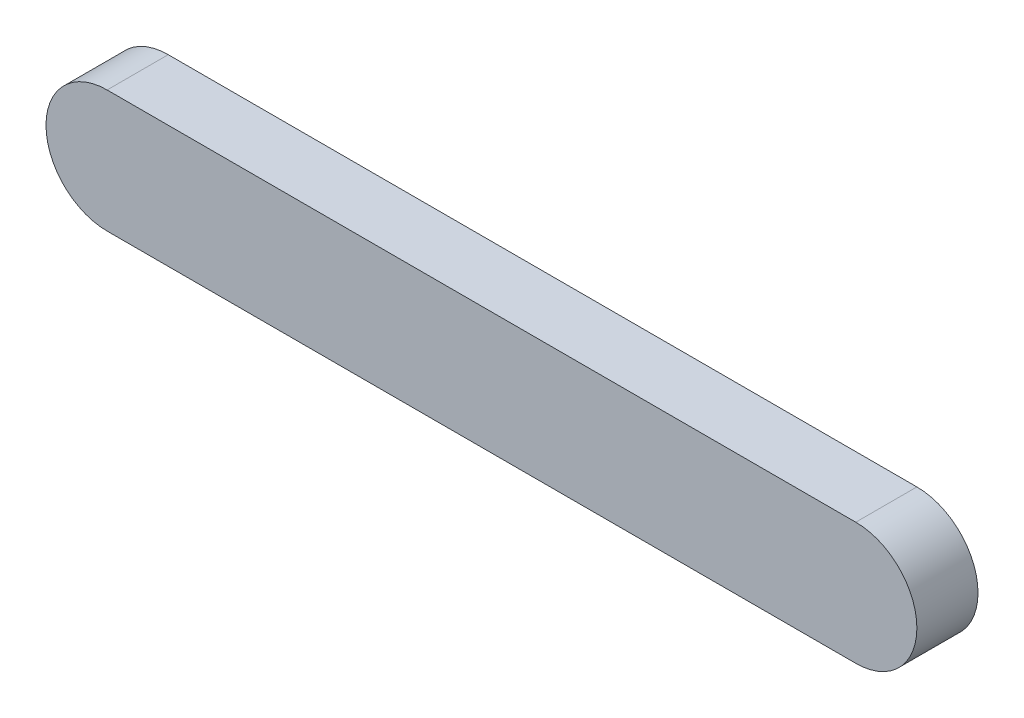
ISO-10303-21;
HEADER;
FILE_DESCRIPTION(('STEP AP214'),'2;1');
FILE_NAME('part.step','',(''),(''),'','','');
FILE_SCHEMA(('AUTOMOTIVE_DESIGN { 1 0 10303 214 1 1 1 1 }'));
ENDSEC;
DATA;
#1=APPLICATION_CONTEXT('core data for automotive mechanical design processes');
#2=APPLICATION_PROTOCOL_DEFINITION('international standard','automotive_design',2000,#1);
#3=PRODUCT_CONTEXT('',#1,'mechanical');
#4=PRODUCT('Part','Part','',(#3));
#5=PRODUCT_RELATED_PRODUCT_CATEGORY('part','',(#4));
#6=PRODUCT_DEFINITION_FORMATION('','',#4);
#7=PRODUCT_DEFINITION_CONTEXT('part definition',#1,'design');
#8=PRODUCT_DEFINITION('design','',#6,#7);
#9=PRODUCT_DEFINITION_SHAPE('','',#8);
#10=(LENGTH_UNIT() NAMED_UNIT(*) SI_UNIT(.MILLI.,.METRE.));
#11=(NAMED_UNIT(*) PLANE_ANGLE_UNIT() SI_UNIT($,.RADIAN.));
#12=(NAMED_UNIT(*) SI_UNIT($,.STERADIAN.) SOLID_ANGLE_UNIT());
#13=UNCERTAINTY_MEASURE_WITH_UNIT(LENGTH_MEASURE(1.E-05),#10,'distance_accuracy_value','');
#14=(GEOMETRIC_REPRESENTATION_CONTEXT(3) GLOBAL_UNCERTAINTY_ASSIGNED_CONTEXT((#13)) GLOBAL_UNIT_ASSIGNED_CONTEXT((#10,
#11,#12)) REPRESENTATION_CONTEXT('',''));
#15=CARTESIAN_POINT('',(0.,0.,0.));
#16=DIRECTION('',(0.,0.,1.));
#17=DIRECTION('',(1.,0.,0.));
#18=AXIS2_PLACEMENT_3D('',#15,#16,#17);
#19=CARTESIAN_POINT('',(0.,0.,20.));
#20=DIRECTION('',(0.,0.,-1.));
#21=DIRECTION('',(-1.,0.,0.));
#22=AXIS2_PLACEMENT_3D('',#19,#20,#21);
#23=CYLINDRICAL_SURFACE('',#22,20.);
#24=CARTESIAN_POINT('',(0.,0.,0.));
#25=DIRECTION('',(0.,0.,1.));
#26=DIRECTION('',(1.,0.,0.));
#27=AXIS2_PLACEMENT_3D('',#24,#25,#26);
#28=CIRCLE('',#27,20.);
#29=CARTESIAN_POINT('',(0.,20.,0.));
#30=VERTEX_POINT('',#29);
#31=CARTESIAN_POINT('',(0.,-20.,0.));
#32=VERTEX_POINT('',#31);
#33=EDGE_CURVE('E102',#30,#32,#28,.T.);
#34=ORIENTED_EDGE('',*,*,#33,.T.);
#35=DIRECTION('',(0.,0.,-1.));
#36=VECTOR('',#35,1.);
#37=CARTESIAN_POINT('',(0.,-20.,20.));
#38=LINE('',#37,#36);
#39=CARTESIAN_POINT('',(0.,-20.,20.));
#40=VERTEX_POINT('',#39);
#41=EDGE_CURVE('E11',#40,#32,#38,.T.);
#42=ORIENTED_EDGE('',*,*,#41,.F.);
#43=CARTESIAN_POINT('',(0.,0.,20.));
#44=DIRECTION('',(0.,0.,1.));
#45=DIRECTION('',(1.,0.,0.));
#46=AXIS2_PLACEMENT_3D('',#43,#44,#45);
#47=CIRCLE('',#46,20.);
#48=CARTESIAN_POINT('',(0.,20.,20.));
#49=VERTEX_POINT('',#48);
#50=EDGE_CURVE('E90',#49,#40,#47,.T.);
#51=ORIENTED_EDGE('',*,*,#50,.F.);
#52=DIRECTION('',(0.,0.,-1.));
#53=VECTOR('',#52,1.);
#54=CARTESIAN_POINT('',(0.,20.,20.));
#55=LINE('',#54,#53);
#56=EDGE_CURVE('E98',#49,#30,#55,.T.);
#57=ORIENTED_EDGE('',*,*,#56,.T.);
#58=EDGE_LOOP('',(#34,#42,#51,#57));
#59=FACE_BOUND('',#58,.T.);
#60=ADVANCED_FACE('F39',(#59),#23,.T.);
#61=CARTESIAN_POINT('',(0.,-20.,20.));
#62=DIRECTION('',(0.,1.,0.));
#63=DIRECTION('',(0.,0.,1.));
#64=AXIS2_PLACEMENT_3D('',#61,#62,#63);
#65=PLANE('',#64);
#66=DIRECTION('',(1.,0.,0.));
#67=VECTOR('',#66,1.);
#68=CARTESIAN_POINT('',(0.,-20.,0.));
#69=LINE('',#68,#67);
#70=CARTESIAN_POINT('',(245.,-20.,0.));
#71=VERTEX_POINT('',#70);
#72=EDGE_CURVE('E94',#32,#71,#69,.T.);
#73=ORIENTED_EDGE('',*,*,#72,.T.);
#74=DIRECTION('',(0.,0.,-1.));
#75=VECTOR('',#74,1.);
#76=CARTESIAN_POINT('',(245.,-20.,20.));
#77=LINE('',#76,#75);
#78=CARTESIAN_POINT('',(245.,-20.,20.));
#79=VERTEX_POINT('',#78);
#80=EDGE_CURVE('E47',#79,#71,#77,.T.);
#81=ORIENTED_EDGE('',*,*,#80,.F.);
#82=DIRECTION('',(1.,0.,0.));
#83=VECTOR('',#82,1.);
#84=CARTESIAN_POINT('',(0.,-20.,20.));
#85=LINE('',#84,#83);
#86=EDGE_CURVE('E85',#40,#79,#85,.T.);
#87=ORIENTED_EDGE('',*,*,#86,.F.);
#88=ORIENTED_EDGE('',*,*,#41,.T.);
#89=EDGE_LOOP('',(#73,#81,#87,#88));
#90=FACE_BOUND('',#89,.T.);
#91=ADVANCED_FACE('F93',(#90),#65,.F.);
#92=CARTESIAN_POINT('',(245.,0.,20.));
#93=DIRECTION('',(0.,0.,-1.));
#94=DIRECTION('',(-1.,0.,0.));
#95=AXIS2_PLACEMENT_3D('',#92,#93,#94);
#96=CYLINDRICAL_SURFACE('',#95,20.);
#97=CARTESIAN_POINT('',(245.,0.,0.));
#98=DIRECTION('',(0.,0.,1.));
#99=DIRECTION('',(1.,0.,0.));
#100=AXIS2_PLACEMENT_3D('',#97,#98,#99);
#101=CIRCLE('',#100,20.);
#102=CARTESIAN_POINT('',(245.,20.,0.));
#103=VERTEX_POINT('',#102);
#104=EDGE_CURVE('E72',#71,#103,#101,.T.);
#105=ORIENTED_EDGE('',*,*,#104,.T.);
#106=DIRECTION('',(0.,0.,-1.));
#107=VECTOR('',#106,1.);
#108=CARTESIAN_POINT('',(245.,20.,20.));
#109=LINE('',#108,#107);
#110=CARTESIAN_POINT('',(245.,20.,20.));
#111=VERTEX_POINT('',#110);
#112=EDGE_CURVE('E95',#111,#103,#109,.T.);
#113=ORIENTED_EDGE('',*,*,#112,.F.);
#114=CARTESIAN_POINT('',(245.,0.,20.));
#115=DIRECTION('',(0.,0.,1.));
#116=DIRECTION('',(1.,0.,0.));
#117=AXIS2_PLACEMENT_3D('',#114,#115,#116);
#118=CIRCLE('',#117,20.);
#119=EDGE_CURVE('E88',#79,#111,#118,.T.);
#120=ORIENTED_EDGE('',*,*,#119,.F.);
#121=ORIENTED_EDGE('',*,*,#80,.T.);
#122=EDGE_LOOP('',(#105,#113,#120,#121));
#123=FACE_BOUND('',#122,.T.);
#124=ADVANCED_FACE('F96',(#123),#96,.T.);
#125=CARTESIAN_POINT('',(0.,20.,20.));
#126=DIRECTION('',(0.,-1.,0.));
#127=DIRECTION('',(0.,0.,-1.));
#128=AXIS2_PLACEMENT_3D('',#125,#126,#127);
#129=PLANE('',#128);
#130=DIRECTION('',(-1.,0.,0.));
#131=VECTOR('',#130,1.);
#132=CARTESIAN_POINT('',(0.,20.,0.));
#133=LINE('',#132,#131);
#134=EDGE_CURVE('E78',#103,#30,#133,.T.);
#135=ORIENTED_EDGE('',*,*,#134,.T.);
#136=ORIENTED_EDGE('',*,*,#56,.F.);
#137=DIRECTION('',(-1.,0.,0.));
#138=VECTOR('',#137,1.);
#139=CARTESIAN_POINT('',(0.,20.,20.));
#140=LINE('',#139,#138);
#141=EDGE_CURVE('E55',#111,#49,#140,.T.);
#142=ORIENTED_EDGE('',*,*,#141,.F.);
#143=ORIENTED_EDGE('',*,*,#112,.T.);
#144=EDGE_LOOP('',(#135,#136,#142,#143));
#145=FACE_BOUND('',#144,.T.);
#146=ADVANCED_FACE('F109',(#145),#129,.F.);
#147=CARTESIAN_POINT('',(0.,0.,20.));
#148=DIRECTION('',(0.,0.,1.));
#149=DIRECTION('',(1.,0.,0.));
#150=AXIS2_PLACEMENT_3D('',#147,#148,#149);
#151=PLANE('',#150);
#152=ORIENTED_EDGE('',*,*,#50,.T.);
#153=ORIENTED_EDGE('',*,*,#86,.T.);
#154=ORIENTED_EDGE('',*,*,#119,.T.);
#155=ORIENTED_EDGE('',*,*,#141,.T.);
#156=EDGE_LOOP('',(#152,#153,#154,#155));
#157=FACE_BOUND('',#156,.T.);
#158=ADVANCED_FACE('F86',(#157),#151,.T.);
#159=CARTESIAN_POINT('',(0.,0.,0.));
#160=DIRECTION('',(0.,0.,1.));
#161=DIRECTION('',(1.,0.,0.));
#162=AXIS2_PLACEMENT_3D('',#159,#160,#161);
#163=PLANE('',#162);
#164=ORIENTED_EDGE('',*,*,#33,.F.);
#165=ORIENTED_EDGE('',*,*,#134,.F.);
#166=ORIENTED_EDGE('',*,*,#104,.F.);
#167=ORIENTED_EDGE('',*,*,#72,.F.);
#168=EDGE_LOOP('',(#164,#165,#166,#167));
#169=FACE_BOUND('',#168,.T.);
#170=ADVANCED_FACE('F112',(#169),#163,.F.);
#171=CLOSED_SHELL('',(#60,#91,#124,#146,#158,#170));
#172=MANIFOLD_SOLID_BREP('B2',#171);
#173=ADVANCED_BREP_SHAPE_REPRESENTATION('',(#18,#172),#14);
#174=SHAPE_DEFINITION_REPRESENTATION(#9,#173);
ENDSEC;
END-ISO-10303-21;
